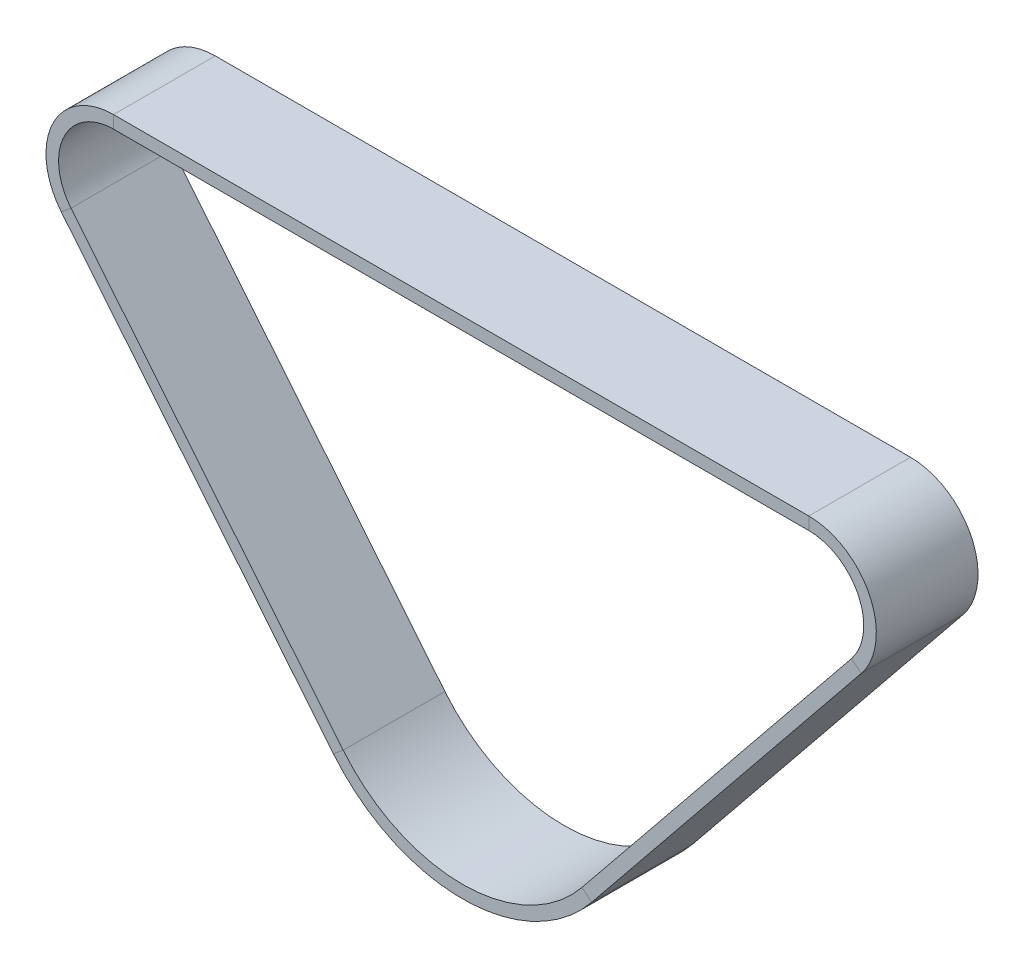
ISO-10303-21;
HEADER;
FILE_DESCRIPTION(('STEP AP214'),'2;1');
FILE_NAME('part.step','',(''),(''),'','','');
FILE_SCHEMA(('AUTOMOTIVE_DESIGN { 1 0 10303 214 1 1 1 1 }'));
ENDSEC;
DATA;
#1=APPLICATION_CONTEXT('core data for automotive mechanical design processes');
#2=APPLICATION_PROTOCOL_DEFINITION('international standard','automotive_design',2000,#1);
#3=PRODUCT_CONTEXT('',#1,'mechanical');
#4=PRODUCT('Part','Part','',(#3));
#5=PRODUCT_RELATED_PRODUCT_CATEGORY('part','',(#4));
#6=PRODUCT_DEFINITION_FORMATION('','',#4);
#7=PRODUCT_DEFINITION_CONTEXT('part definition',#1,'design');
#8=PRODUCT_DEFINITION('design','',#6,#7);
#9=PRODUCT_DEFINITION_SHAPE('','',#8);
#10=(LENGTH_UNIT() NAMED_UNIT(*) SI_UNIT(.MILLI.,.METRE.));
#11=(NAMED_UNIT(*) PLANE_ANGLE_UNIT() SI_UNIT($,.RADIAN.));
#12=(NAMED_UNIT(*) SI_UNIT($,.STERADIAN.) SOLID_ANGLE_UNIT());
#13=UNCERTAINTY_MEASURE_WITH_UNIT(LENGTH_MEASURE(1.E-05),#10,'distance_accuracy_value','');
#14=(GEOMETRIC_REPRESENTATION_CONTEXT(3) GLOBAL_UNCERTAINTY_ASSIGNED_CONTEXT((#13)) GLOBAL_UNIT_ASSIGNED_CONTEXT((#10,
#11,#12)) REPRESENTATION_CONTEXT('',''));
#15=CARTESIAN_POINT('',(0.,0.,0.));
#16=DIRECTION('',(0.,0.,1.));
#17=DIRECTION('',(1.,0.,0.));
#18=AXIS2_PLACEMENT_3D('',#15,#16,#17);
#19=CARTESIAN_POINT('',(86.8218168177366,8.43740000000001,6.35));
#20=DIRECTION('',(0.,0.,-1.));
#21=DIRECTION('',(-1.,0.,0.));
#22=AXIS2_PLACEMENT_3D('',#19,#20,#21);
#23=PLANE('',#22);
#24=DIRECTION('',(0.,-1.,0.));
#25=VECTOR('',#24,1.);
#26=CARTESIAN_POINT('',(86.8218168177366,8.43740000000001,6.35));
#27=LINE('',#26,#25);
#28=CARTESIAN_POINT('',(86.8218168177366,8.43740000000001,6.35));
#29=VERTEX_POINT('',#28);
#30=CARTESIAN_POINT('',(86.8218168177366,6.86260000000001,6.35));
#31=VERTEX_POINT('',#30);
#32=EDGE_CURVE('E187',#29,#31,#27,.T.);
#33=ORIENTED_EDGE('',*,*,#32,.F.);
#34=DIRECTION('',(-1.,0.,0.));
#35=VECTOR('',#34,1.);
#36=CARTESIAN_POINT('',(86.8218168177366,8.43740000000001,6.35));
#37=LINE('',#36,#35);
#38=CARTESIAN_POINT('',(0.,8.4374,6.35));
#39=VERTEX_POINT('',#38);
#40=EDGE_CURVE('E186',#29,#39,#37,.T.);
#41=ORIENTED_EDGE('',*,*,#40,.T.);
#42=DIRECTION('',(0.,-1.,0.));
#43=VECTOR('',#42,1.);
#44=CARTESIAN_POINT('',(0.,8.4374,6.35));
#45=LINE('',#44,#43);
#46=CARTESIAN_POINT('',(0.,6.8626,6.35));
#47=VERTEX_POINT('',#46);
#48=EDGE_CURVE('E161',#39,#47,#45,.T.);
#49=ORIENTED_EDGE('',*,*,#48,.T.);
#50=DIRECTION('',(-1.,0.,0.));
#51=VECTOR('',#50,1.);
#52=CARTESIAN_POINT('',(86.8218168177366,6.86260000000001,6.35));
#53=LINE('',#52,#51);
#54=EDGE_CURVE('E191',#31,#47,#53,.T.);
#55=ORIENTED_EDGE('',*,*,#54,.F.);
#56=EDGE_LOOP('',(#33,#41,#49,#55));
#57=FACE_BOUND('',#56,.T.);
#58=ADVANCED_FACE('F41',(#57),#23,.F.);
#59=CARTESIAN_POINT('',(0.,8.4374,6.35));
#60=DIRECTION('',(0.,0.,-1.));
#61=DIRECTION('',(-1.,0.,0.));
#62=AXIS2_PLACEMENT_3D('',#59,#60,#61);
#63=PLANE('',#62);
#64=CARTESIAN_POINT('',(0.,0.,6.35));
#65=DIRECTION('',(0.,0.,1.));
#66=DIRECTION('',(0.,1.,0.));
#67=AXIS2_PLACEMENT_3D('',#64,#65,#66);
#68=CIRCLE('',#67,6.8626);
#69=CARTESIAN_POINT('',(-5.31507576768059,-4.34111141803738,6.35));
#70=VERTEX_POINT('',#69);
#71=EDGE_CURVE('E167',#47,#70,#68,.T.);
#72=ORIENTED_EDGE('',*,*,#71,.F.);
#73=ORIENTED_EDGE('',*,*,#48,.F.);
#74=CARTESIAN_POINT('',(0.,0.,6.35));
#75=DIRECTION('',(0.,0.,1.));
#76=DIRECTION('',(0.,1.,0.));
#77=AXIS2_PLACEMENT_3D('',#74,#75,#76);
#78=CIRCLE('',#77,8.4374);
#79=CARTESIAN_POINT('',(-6.53475654740597,-5.33729103817046,6.35));
#80=VERTEX_POINT('',#79);
#81=EDGE_CURVE('E165',#39,#80,#78,.T.);
#82=ORIENTED_EDGE('',*,*,#81,.T.);
#83=DIRECTION('',(0.774498844123305,0.632575323935153,0.));
#84=VECTOR('',#83,1.);
#85=CARTESIAN_POINT('',(-6.53475654740597,-5.33729103817046,6.35));
#86=LINE('',#85,#84);
#87=EDGE_CURVE('E183',#80,#70,#86,.T.);
#88=ORIENTED_EDGE('',*,*,#87,.T.);
#89=EDGE_LOOP('',(#72,#73,#82,#88));
#90=FACE_BOUND('',#89,.T.);
#91=ADVANCED_FACE('F163',(#90),#63,.F.);
#92=CARTESIAN_POINT('',(0.,0.,0.));
#93=DIRECTION('',(0.,0.,1.));
#94=DIRECTION('',(1.,0.,0.));
#95=AXIS2_PLACEMENT_3D('',#92,#93,#94);
#96=CYLINDRICAL_SURFACE('',#95,6.8626);
#97=CARTESIAN_POINT('',(0.,0.,-6.35));
#98=DIRECTION('',(0.,0.,1.));
#99=DIRECTION('',(0.,1.,0.));
#100=AXIS2_PLACEMENT_3D('',#97,#98,#99);
#101=CIRCLE('',#100,6.8626);
#102=CARTESIAN_POINT('',(0.,6.8626,-6.35));
#103=VERTEX_POINT('',#102);
#104=CARTESIAN_POINT('',(-5.31507576768059,-4.34111141803738,-6.35));
#105=VERTEX_POINT('',#104);
#106=EDGE_CURVE('E237',#103,#105,#101,.T.);
#107=ORIENTED_EDGE('',*,*,#106,.F.);
#108=DIRECTION('',(0.,0.,-1.));
#109=VECTOR('',#108,1.);
#110=CARTESIAN_POINT('',(0.,6.8626,6.35));
#111=LINE('',#110,#109);
#112=EDGE_CURVE('E172',#47,#103,#111,.T.);
#113=ORIENTED_EDGE('',*,*,#112,.F.);
#114=ORIENTED_EDGE('',*,*,#71,.T.);
#115=DIRECTION('',(0.,0.,-1.));
#116=VECTOR('',#115,1.);
#117=CARTESIAN_POINT('',(-5.31507576768059,-4.34111141803738,6.35));
#118=LINE('',#117,#116);
#119=EDGE_CURVE('E269',#70,#105,#118,.T.);
#120=ORIENTED_EDGE('',*,*,#119,.T.);
#121=EDGE_LOOP('',(#107,#113,#114,#120));
#122=FACE_BOUND('',#121,.T.);
#123=ADVANCED_FACE('F314',(#122),#96,.F.);
#124=CARTESIAN_POINT('',(0.,8.4374,-6.35));
#125=DIRECTION('',(0.,0.,1.));
#126=DIRECTION('',(1.,0.,0.));
#127=AXIS2_PLACEMENT_3D('',#124,#125,#126);
#128=PLANE('',#127);
#129=CARTESIAN_POINT('',(0.,0.,-6.35));
#130=DIRECTION('',(0.,0.,1.));
#131=DIRECTION('',(0.,1.,0.));
#132=AXIS2_PLACEMENT_3D('',#129,#130,#131);
#133=CIRCLE('',#132,8.4374);
#134=CARTESIAN_POINT('',(0.,8.4374,-6.35));
#135=VERTEX_POINT('',#134);
#136=CARTESIAN_POINT('',(-6.53475654740597,-5.33729103817046,-6.35));
#137=VERTEX_POINT('',#136);
#138=EDGE_CURVE('E202',#135,#137,#133,.T.);
#139=ORIENTED_EDGE('',*,*,#138,.F.);
#140=DIRECTION('',(0.,1.,0.));
#141=VECTOR('',#140,1.);
#142=CARTESIAN_POINT('',(0.,8.4374,-6.35));
#143=LINE('',#142,#141);
#144=EDGE_CURVE('E194',#103,#135,#143,.T.);
#145=ORIENTED_EDGE('',*,*,#144,.F.);
#146=ORIENTED_EDGE('',*,*,#106,.T.);
#147=DIRECTION('',(-0.774498844123305,-0.632575323935153,0.));
#148=VECTOR('',#147,1.);
#149=CARTESIAN_POINT('',(-6.53475654740597,-5.33729103817046,-6.35));
#150=LINE('',#149,#148);
#151=EDGE_CURVE('E240',#105,#137,#150,.T.);
#152=ORIENTED_EDGE('',*,*,#151,.T.);
#153=EDGE_LOOP('',(#139,#145,#146,#152));
#154=FACE_BOUND('',#153,.T.);
#155=ADVANCED_FACE('F235',(#154),#128,.F.);
#156=CARTESIAN_POINT('',(0.,0.,0.));
#157=DIRECTION('',(0.,0.,1.));
#158=DIRECTION('',(1.,0.,0.));
#159=AXIS2_PLACEMENT_3D('',#156,#157,#158);
#160=CYLINDRICAL_SURFACE('',#159,8.4374);
#161=DIRECTION('',(0.,0.,1.));
#162=VECTOR('',#161,1.);
#163=CARTESIAN_POINT('',(-6.53475654740597,-5.33729103817046,6.35));
#164=LINE('',#163,#162);
#165=EDGE_CURVE('E181',#137,#80,#164,.T.);
#166=ORIENTED_EDGE('',*,*,#165,.T.);
#167=ORIENTED_EDGE('',*,*,#81,.F.);
#168=DIRECTION('',(0.,0.,1.));
#169=VECTOR('',#168,1.);
#170=CARTESIAN_POINT('',(0.,8.4374,6.35));
#171=LINE('',#170,#169);
#172=EDGE_CURVE('E179',#135,#39,#171,.T.);
#173=ORIENTED_EDGE('',*,*,#172,.F.);
#174=ORIENTED_EDGE('',*,*,#138,.T.);
#175=EDGE_LOOP('',(#166,#167,#173,#174));
#176=FACE_BOUND('',#175,.T.);
#177=ADVANCED_FACE('F177',(#176),#160,.T.);
#178=CARTESIAN_POINT('',(-6.53475654740598,-5.33729103817046,6.35));
#179=DIRECTION('',(0.,0.,-1.));
#180=DIRECTION('',(-1.,0.,0.));
#181=AXIS2_PLACEMENT_3D('',#178,#179,#180);
#182=PLANE('',#181);
#183=DIRECTION('',(0.632575323935153,-0.774498844123305,0.));
#184=VECTOR('',#183,1.);
#185=CARTESIAN_POINT('',(-5.3150757676806,-4.34111141803738,6.35));
#186=LINE('',#185,#184);
#187=CARTESIAN_POINT('',(28.6807719162639,-45.9642094744297,6.35));
#188=VERTEX_POINT('',#187);
#189=EDGE_CURVE('E274',#70,#188,#186,.T.);
#190=ORIENTED_EDGE('',*,*,#189,.F.);
#191=ORIENTED_EDGE('',*,*,#87,.F.);
#192=DIRECTION('',(0.632575323935153,-0.774498844123305,0.));
#193=VECTOR('',#192,1.);
#194=CARTESIAN_POINT('',(-6.53475654740598,-5.33729103817046,6.35));
#195=LINE('',#194,#193);
#196=CARTESIAN_POINT('',(27.4610911365385,-46.9603890945627,6.35));
#197=VERTEX_POINT('',#196);
#198=EDGE_CURVE('E201',#80,#197,#195,.T.);
#199=ORIENTED_EDGE('',*,*,#198,.T.);
#200=DIRECTION('',(0.774498844123305,0.632575323935153,0.));
#201=VECTOR('',#200,1.);
#202=CARTESIAN_POINT('',(27.4610911365386,-46.9603890945628,6.35));
#203=LINE('',#202,#201);
#204=EDGE_CURVE('E293',#197,#188,#203,.T.);
#205=ORIENTED_EDGE('',*,*,#204,.T.);
#206=EDGE_LOOP('',(#190,#191,#199,#205));
#207=FACE_BOUND('',#206,.T.);
#208=ADVANCED_FACE('F317',(#207),#182,.F.);
#209=CARTESIAN_POINT('',(-5.3150757676806,-4.34111141803738,6.35));
#210=DIRECTION('',(-0.774498844123305,-0.632575323935153,0.));
#211=DIRECTION('',(0.632575323935153,-0.774498844123306,0.));
#212=AXIS2_PLACEMENT_3D('',#209,#210,#211);
#213=PLANE('',#212);
#214=DIRECTION('',(0.632575323935153,-0.774498844123305,0.));
#215=VECTOR('',#214,1.);
#216=CARTESIAN_POINT('',(-5.31507576768059,-4.34111141803738,-6.35));
#217=LINE('',#216,#215);
#218=CARTESIAN_POINT('',(28.6807719162639,-45.9642094744297,-6.35));
#219=VERTEX_POINT('',#218);
#220=EDGE_CURVE('E248',#105,#219,#217,.T.);
#221=ORIENTED_EDGE('',*,*,#220,.F.);
#222=ORIENTED_EDGE('',*,*,#119,.F.);
#223=ORIENTED_EDGE('',*,*,#189,.T.);
#224=DIRECTION('',(0.,0.,-1.));
#225=VECTOR('',#224,1.);
#226=CARTESIAN_POINT('',(28.6807719162639,-45.9642094744297,6.35));
#227=LINE('',#226,#225);
#228=EDGE_CURVE('E272',#188,#219,#227,.T.);
#229=ORIENTED_EDGE('',*,*,#228,.T.);
#230=EDGE_LOOP('',(#221,#222,#223,#229));
#231=FACE_BOUND('',#230,.T.);
#232=ADVANCED_FACE('F280',(#231),#213,.F.);
#233=CARTESIAN_POINT('',(-6.53475654740598,-5.33729103817046,-6.35));
#234=DIRECTION('',(0.,0.,1.));
#235=DIRECTION('',(1.,0.,0.));
#236=AXIS2_PLACEMENT_3D('',#233,#234,#235);
#237=PLANE('',#236);
#238=DIRECTION('',(0.632575323935153,-0.774498844123305,0.));
#239=VECTOR('',#238,1.);
#240=CARTESIAN_POINT('',(-6.53475654740598,-5.33729103817046,-6.35));
#241=LINE('',#240,#239);
#242=CARTESIAN_POINT('',(27.4610911365385,-46.9603890945627,-6.35));
#243=VERTEX_POINT('',#242);
#244=EDGE_CURVE('E207',#137,#243,#241,.T.);
#245=ORIENTED_EDGE('',*,*,#244,.F.);
#246=ORIENTED_EDGE('',*,*,#151,.F.);
#247=ORIENTED_EDGE('',*,*,#220,.T.);
#248=DIRECTION('',(-0.774498844123305,-0.632575323935153,0.));
#249=VECTOR('',#248,1.);
#250=CARTESIAN_POINT('',(27.4610911365386,-46.9603890945628,-6.35));
#251=LINE('',#250,#249);
#252=EDGE_CURVE('E245',#219,#243,#251,.T.);
#253=ORIENTED_EDGE('',*,*,#252,.T.);
#254=EDGE_LOOP('',(#245,#246,#247,#253));
#255=FACE_BOUND('',#254,.T.);
#256=ADVANCED_FACE('F277',(#255),#237,.F.);
#257=CARTESIAN_POINT('',(-6.53475654740598,-5.33729103817046,6.35));
#258=DIRECTION('',(0.774498844123305,0.632575323935153,0.));
#259=DIRECTION('',(-0.632575323935153,0.774498844123306,0.));
#260=AXIS2_PLACEMENT_3D('',#257,#258,#259);
#261=PLANE('',#260);
#262=DIRECTION('',(0.,0.,1.));
#263=VECTOR('',#262,1.);
#264=CARTESIAN_POINT('',(27.4610911365386,-46.9603890945628,6.35));
#265=LINE('',#264,#263);
#266=EDGE_CURVE('E203',#243,#197,#265,.T.);
#267=ORIENTED_EDGE('',*,*,#266,.T.);
#268=ORIENTED_EDGE('',*,*,#198,.F.);
#269=ORIENTED_EDGE('',*,*,#165,.F.);
#270=ORIENTED_EDGE('',*,*,#244,.T.);
#271=EDGE_LOOP('',(#267,#268,#269,#270));
#272=FACE_BOUND('',#271,.T.);
#273=ADVANCED_FACE('F290',(#272),#261,.F.);
#274=CARTESIAN_POINT('',(27.4610911365386,-46.9603890945628,6.35));
#275=DIRECTION('',(0.,0.,-1.));
#276=DIRECTION('',(-1.,0.,0.));
#277=AXIS2_PLACEMENT_3D('',#274,#275,#276);
#278=PLANE('',#277);
#279=CARTESIAN_POINT('',(43.5609084088674,-33.8107928057932,6.35));
#280=DIRECTION('',(0.,0.,1.));
#281=DIRECTION('',(-0.774498844123305,-0.632575323935153,0.));
#282=AXIS2_PLACEMENT_3D('',#279,#280,#281);
#283=CIRCLE('',#282,19.2126);
#284=CARTESIAN_POINT('',(58.4936612595163,-45.8995020446423,6.35));
#285=VERTEX_POINT('',#284);
#286=EDGE_CURVE('E142',#188,#285,#283,.T.);
#287=ORIENTED_EDGE('',*,*,#286,.F.);
#288=ORIENTED_EDGE('',*,*,#204,.F.);
#289=CARTESIAN_POINT('',(43.5609084088674,-33.8107928057932,6.35));
#290=DIRECTION('',(0.,0.,1.));
#291=DIRECTION('',(-0.774498844123305,-0.632575323935153,0.));
#292=AXIS2_PLACEMENT_3D('',#289,#290,#291);
#293=CIRCLE('',#292,20.7874);
#294=CARTESIAN_POINT('',(59.7176548464958,-46.8903777881304,6.35));
#295=VERTEX_POINT('',#294);
#296=EDGE_CURVE('E206',#197,#295,#293,.T.);
#297=ORIENTED_EDGE('',*,*,#296,.T.);
#298=DIRECTION('',(-0.777237482206934,0.629207355529658,0.));
#299=VECTOR('',#298,1.);
#300=CARTESIAN_POINT('',(59.7176548464958,-46.8903777881304,6.35));
#301=LINE('',#300,#299);
#302=EDGE_CURVE('E298',#295,#285,#301,.T.);
#303=ORIENTED_EDGE('',*,*,#302,.T.);
#304=EDGE_LOOP('',(#287,#288,#297,#303));
#305=FACE_BOUND('',#304,.T.);
#306=ADVANCED_FACE('F319',(#305),#278,.F.);
#307=CARTESIAN_POINT('',(43.5609084088674,-33.8107928057932,0.));
#308=DIRECTION('',(0.,0.,1.));
#309=DIRECTION('',(1.,0.,0.));
#310=AXIS2_PLACEMENT_3D('',#307,#308,#309);
#311=CYLINDRICAL_SURFACE('',#310,19.2126);
#312=CARTESIAN_POINT('',(43.5609084088674,-33.8107928057932,-6.35));
#313=DIRECTION('',(0.,0.,1.));
#314=DIRECTION('',(-0.774498844123306,-0.632575323935153,0.));
#315=AXIS2_PLACEMENT_3D('',#312,#313,#314);
#316=CIRCLE('',#315,19.2126);
#317=CARTESIAN_POINT('',(58.4936612595163,-45.8995020446423,-6.35));
#318=VERTEX_POINT('',#317);
#319=EDGE_CURVE('E136',#219,#318,#316,.T.);
#320=ORIENTED_EDGE('',*,*,#319,.F.);
#321=ORIENTED_EDGE('',*,*,#228,.F.);
#322=ORIENTED_EDGE('',*,*,#286,.T.);
#323=DIRECTION('',(0.,0.,-1.));
#324=VECTOR('',#323,1.);
#325=CARTESIAN_POINT('',(58.4936612595163,-45.8995020446423,6.35));
#326=LINE('',#325,#324);
#327=EDGE_CURVE('E251',#285,#318,#326,.T.);
#328=ORIENTED_EDGE('',*,*,#327,.T.);
#329=EDGE_LOOP('',(#320,#321,#322,#328));
#330=FACE_BOUND('',#329,.T.);
#331=ADVANCED_FACE('F283',(#330),#311,.F.);
#332=CARTESIAN_POINT('',(27.4610911365386,-46.9603890945628,-6.35));
#333=DIRECTION('',(0.,0.,1.));
#334=DIRECTION('',(1.,0.,0.));
#335=AXIS2_PLACEMENT_3D('',#332,#333,#334);
#336=PLANE('',#335);
#337=CARTESIAN_POINT('',(43.5609084088674,-33.8107928057932,-6.35));
#338=DIRECTION('',(0.,0.,1.));
#339=DIRECTION('',(-0.774498844123305,-0.632575323935153,0.));
#340=AXIS2_PLACEMENT_3D('',#337,#338,#339);
#341=CIRCLE('',#340,20.7874);
#342=CARTESIAN_POINT('',(59.7176548464958,-46.8903777881304,-6.35));
#343=VERTEX_POINT('',#342);
#344=EDGE_CURVE('E211',#243,#343,#341,.T.);
#345=ORIENTED_EDGE('',*,*,#344,.F.);
#346=ORIENTED_EDGE('',*,*,#252,.F.);
#347=ORIENTED_EDGE('',*,*,#319,.T.);
#348=DIRECTION('',(0.777237482206934,-0.629207355529658,0.));
#349=VECTOR('',#348,1.);
#350=CARTESIAN_POINT('',(59.7176548464958,-46.8903777881304,-6.35));
#351=LINE('',#350,#349);
#352=EDGE_CURVE('E249',#318,#343,#351,.T.);
#353=ORIENTED_EDGE('',*,*,#352,.T.);
#354=EDGE_LOOP('',(#345,#346,#347,#353));
#355=FACE_BOUND('',#354,.T.);
#356=ADVANCED_FACE('F284',(#355),#336,.F.);
#357=CARTESIAN_POINT('',(43.5609084088674,-33.8107928057932,0.));
#358=DIRECTION('',(0.,0.,1.));
#359=DIRECTION('',(1.,0.,0.));
#360=AXIS2_PLACEMENT_3D('',#357,#358,#359);
#361=CYLINDRICAL_SURFACE('',#360,20.7874);
#362=DIRECTION('',(0.,0.,1.));
#363=VECTOR('',#362,1.);
#364=CARTESIAN_POINT('',(59.7176548464958,-46.8903777881304,6.35));
#365=LINE('',#364,#363);
#366=EDGE_CURVE('E208',#343,#295,#365,.T.);
#367=ORIENTED_EDGE('',*,*,#366,.T.);
#368=ORIENTED_EDGE('',*,*,#296,.F.);
#369=ORIENTED_EDGE('',*,*,#266,.F.);
#370=ORIENTED_EDGE('',*,*,#344,.T.);
#371=EDGE_LOOP('',(#367,#368,#369,#370));
#372=FACE_BOUND('',#371,.T.);
#373=ADVANCED_FACE('F288',(#372),#361,.T.);
#374=CARTESIAN_POINT('',(59.7176548464958,-46.8903777881304,6.35));
#375=DIRECTION('',(0.,0.,-1.));
#376=DIRECTION('',(-1.,0.,0.));
#377=AXIS2_PLACEMENT_3D('',#374,#375,#376);
#378=PLANE('',#377);
#379=DIRECTION('',(0.629207355529658,0.777237482206934,0.));
#380=VECTOR('',#379,1.);
#381=CARTESIAN_POINT('',(58.4936612595163,-45.8995020446423,6.35));
#382=LINE('',#381,#380);
#383=CARTESIAN_POINT('',(92.1556867631299,-4.31799839805783,6.35));
#384=VERTEX_POINT('',#383);
#385=EDGE_CURVE('E116',#285,#384,#382,.T.);
#386=ORIENTED_EDGE('',*,*,#385,.F.);
#387=ORIENTED_EDGE('',*,*,#302,.F.);
#388=DIRECTION('',(0.629207355529658,0.777237482206934,0.));
#389=VECTOR('',#388,1.);
#390=CARTESIAN_POINT('',(59.7176548464958,-46.8903777881304,6.35));
#391=LINE('',#390,#389);
#392=CARTESIAN_POINT('',(93.3796803501094,-5.30887414154593,6.35));
#393=VERTEX_POINT('',#392);
#394=EDGE_CURVE('E210',#295,#393,#391,.T.);
#395=ORIENTED_EDGE('',*,*,#394,.T.);
#396=DIRECTION('',(-0.777237482206935,0.629207355529658,0.));
#397=VECTOR('',#396,1.);
#398=CARTESIAN_POINT('',(93.3796803501094,-5.30887414154592,6.35));
#399=LINE('',#398,#397);
#400=EDGE_CURVE('E220',#393,#384,#399,.T.);
#401=ORIENTED_EDGE('',*,*,#400,.T.);
#402=EDGE_LOOP('',(#386,#387,#395,#401));
#403=FACE_BOUND('',#402,.T.);
#404=ADVANCED_FACE('F322',(#403),#378,.F.);
#405=CARTESIAN_POINT('',(58.4936612595163,-45.8995020446423,6.35));
#406=DIRECTION('',(0.777237482206935,-0.629207355529658,0.));
#407=DIRECTION('',(0.629207355529658,0.777237482206935,0.));
#408=AXIS2_PLACEMENT_3D('',#405,#406,#407);
#409=PLANE('',#408);
#410=DIRECTION('',(0.629207355529658,0.777237482206934,0.));
#411=VECTOR('',#410,1.);
#412=CARTESIAN_POINT('',(58.4936612595163,-45.8995020446423,-6.35));
#413=LINE('',#412,#411);
#414=CARTESIAN_POINT('',(92.1556867631299,-4.31799839805783,-6.35));
#415=VERTEX_POINT('',#414);
#416=EDGE_CURVE('E109',#318,#415,#413,.T.);
#417=ORIENTED_EDGE('',*,*,#416,.F.);
#418=ORIENTED_EDGE('',*,*,#327,.F.);
#419=ORIENTED_EDGE('',*,*,#385,.T.);
#420=DIRECTION('',(0.,0.,-1.));
#421=VECTOR('',#420,1.);
#422=CARTESIAN_POINT('',(92.1556867631299,-4.31799839805782,6.35));
#423=LINE('',#422,#421);
#424=EDGE_CURVE('E218',#384,#415,#423,.T.);
#425=ORIENTED_EDGE('',*,*,#424,.T.);
#426=EDGE_LOOP('',(#417,#418,#419,#425));
#427=FACE_BOUND('',#426,.T.);
#428=ADVANCED_FACE('F323',(#427),#409,.F.);
#429=CARTESIAN_POINT('',(59.7176548464958,-46.8903777881304,-6.35));
#430=DIRECTION('',(0.,0.,1.));
#431=DIRECTION('',(1.,0.,0.));
#432=AXIS2_PLACEMENT_3D('',#429,#430,#431);
#433=PLANE('',#432);
#434=DIRECTION('',(0.629207355529658,0.777237482206934,0.));
#435=VECTOR('',#434,1.);
#436=CARTESIAN_POINT('',(59.7176548464958,-46.8903777881304,-6.35));
#437=LINE('',#436,#435);
#438=CARTESIAN_POINT('',(93.3796803501094,-5.30887414154593,-6.35));
#439=VERTEX_POINT('',#438);
#440=EDGE_CURVE('E100',#343,#439,#437,.T.);
#441=ORIENTED_EDGE('',*,*,#440,.F.);
#442=ORIENTED_EDGE('',*,*,#352,.F.);
#443=ORIENTED_EDGE('',*,*,#416,.T.);
#444=DIRECTION('',(0.777237482206935,-0.629207355529658,0.));
#445=VECTOR('',#444,1.);
#446=CARTESIAN_POINT('',(93.3796803501094,-5.30887414154592,-6.35));
#447=LINE('',#446,#445);
#448=EDGE_CURVE('E214',#415,#439,#447,.T.);
#449=ORIENTED_EDGE('',*,*,#448,.T.);
#450=EDGE_LOOP('',(#441,#442,#443,#449));
#451=FACE_BOUND('',#450,.T.);
#452=ADVANCED_FACE('F324',(#451),#433,.F.);
#453=CARTESIAN_POINT('',(59.7176548464958,-46.8903777881304,6.35));
#454=DIRECTION('',(-0.777237482206935,0.629207355529658,0.));
#455=DIRECTION('',(-0.629207355529658,-0.777237482206935,0.));
#456=AXIS2_PLACEMENT_3D('',#453,#454,#455);
#457=PLANE('',#456);
#458=DIRECTION('',(0.,0.,1.));
#459=VECTOR('',#458,1.);
#460=CARTESIAN_POINT('',(93.3796803501094,-5.30887414154592,6.35));
#461=LINE('',#460,#459);
#462=EDGE_CURVE('E212',#439,#393,#461,.T.);
#463=ORIENTED_EDGE('',*,*,#462,.T.);
#464=ORIENTED_EDGE('',*,*,#394,.F.);
#465=ORIENTED_EDGE('',*,*,#366,.F.);
#466=ORIENTED_EDGE('',*,*,#440,.T.);
#467=EDGE_LOOP('',(#463,#464,#465,#466));
#468=FACE_BOUND('',#467,.T.);
#469=ADVANCED_FACE('F325',(#468),#457,.F.);
#470=CARTESIAN_POINT('',(93.3796803501094,-5.30887414154592,6.35));
#471=DIRECTION('',(0.,0.,-1.));
#472=DIRECTION('',(-1.,0.,0.));
#473=AXIS2_PLACEMENT_3D('',#470,#471,#472);
#474=PLANE('',#473);
#475=CARTESIAN_POINT('',(86.8218168177366,0.,6.35));
#476=DIRECTION('',(0.,0.,1.));
#477=DIRECTION('',(0.777237482206935,-0.629207355529658,0.));
#478=AXIS2_PLACEMENT_3D('',#475,#476,#477);
#479=CIRCLE('',#478,6.8626);
#480=EDGE_CURVE('E259',#384,#31,#479,.T.);
#481=ORIENTED_EDGE('',*,*,#480,.F.);
#482=ORIENTED_EDGE('',*,*,#400,.F.);
#483=CARTESIAN_POINT('',(86.8218168177366,0.,6.35));
#484=DIRECTION('',(0.,0.,1.));
#485=DIRECTION('',(0.777237482206934,-0.629207355529658,0.));
#486=AXIS2_PLACEMENT_3D('',#483,#484,#485);
#487=CIRCLE('',#486,8.43739999999999);
#488=EDGE_CURVE('E213',#393,#29,#487,.T.);
#489=ORIENTED_EDGE('',*,*,#488,.T.);
#490=ORIENTED_EDGE('',*,*,#32,.T.);
#491=EDGE_LOOP('',(#481,#482,#489,#490));
#492=FACE_BOUND('',#491,.T.);
#493=ADVANCED_FACE('F326',(#492),#474,.F.);
#494=CARTESIAN_POINT('',(86.8218168177366,0.,0.));
#495=DIRECTION('',(0.,0.,1.));
#496=DIRECTION('',(1.,0.,0.));
#497=AXIS2_PLACEMENT_3D('',#494,#495,#496);
#498=CYLINDRICAL_SURFACE('',#497,6.8626);
#499=CARTESIAN_POINT('',(86.8218168177366,0.,-6.35));
#500=DIRECTION('',(0.,0.,1.));
#501=DIRECTION('',(0.777237482206935,-0.629207355529658,0.));
#502=AXIS2_PLACEMENT_3D('',#499,#500,#501);
#503=CIRCLE('',#502,6.8626);
#504=CARTESIAN_POINT('',(86.8218168177366,6.86260000000001,-6.35));
#505=VERTEX_POINT('',#504);
#506=EDGE_CURVE('E66',#415,#505,#503,.T.);
#507=ORIENTED_EDGE('',*,*,#506,.F.);
#508=ORIENTED_EDGE('',*,*,#424,.F.);
#509=ORIENTED_EDGE('',*,*,#480,.T.);
#510=DIRECTION('',(0.,0.,-1.));
#511=VECTOR('',#510,1.);
#512=CARTESIAN_POINT('',(86.8218168177366,6.86260000000001,6.35));
#513=LINE('',#512,#511);
#514=EDGE_CURVE('E257',#31,#505,#513,.T.);
#515=ORIENTED_EDGE('',*,*,#514,.T.);
#516=EDGE_LOOP('',(#507,#508,#509,#515));
#517=FACE_BOUND('',#516,.T.);
#518=ADVANCED_FACE('F309',(#517),#498,.F.);
#519=CARTESIAN_POINT('',(93.3796803501094,-5.30887414154592,-6.35));
#520=DIRECTION('',(0.,0.,1.));
#521=DIRECTION('',(1.,0.,0.));
#522=AXIS2_PLACEMENT_3D('',#519,#520,#521);
#523=PLANE('',#522);
#524=CARTESIAN_POINT('',(86.8218168177366,0.,-6.35));
#525=DIRECTION('',(0.,0.,1.));
#526=DIRECTION('',(0.777237482206934,-0.629207355529658,0.));
#527=AXIS2_PLACEMENT_3D('',#524,#525,#526);
#528=CIRCLE('',#527,8.43739999999999);
#529=CARTESIAN_POINT('',(86.8218168177366,8.43740000000001,-6.35));
#530=VERTEX_POINT('',#529);
#531=EDGE_CURVE('E58',#439,#530,#528,.T.);
#532=ORIENTED_EDGE('',*,*,#531,.F.);
#533=ORIENTED_EDGE('',*,*,#448,.F.);
#534=ORIENTED_EDGE('',*,*,#506,.T.);
#535=DIRECTION('',(0.,1.,0.));
#536=VECTOR('',#535,1.);
#537=CARTESIAN_POINT('',(86.8218168177366,8.43740000000001,-6.35));
#538=LINE('',#537,#536);
#539=EDGE_CURVE('E226',#505,#530,#538,.T.);
#540=ORIENTED_EDGE('',*,*,#539,.T.);
#541=EDGE_LOOP('',(#532,#533,#534,#540));
#542=FACE_BOUND('',#541,.T.);
#543=ADVANCED_FACE('F333',(#542),#523,.F.);
#544=CARTESIAN_POINT('',(86.8218168177366,0.,0.));
#545=DIRECTION('',(0.,0.,1.));
#546=DIRECTION('',(1.,0.,0.));
#547=AXIS2_PLACEMENT_3D('',#544,#545,#546);
#548=CYLINDRICAL_SURFACE('',#547,8.43739999999999);
#549=DIRECTION('',(0.,0.,1.));
#550=VECTOR('',#549,1.);
#551=CARTESIAN_POINT('',(86.8218168177366,8.43740000000001,6.35));
#552=LINE('',#551,#550);
#553=EDGE_CURVE('E45',#530,#29,#552,.T.);
#554=ORIENTED_EDGE('',*,*,#553,.T.);
#555=ORIENTED_EDGE('',*,*,#488,.F.);
#556=ORIENTED_EDGE('',*,*,#462,.F.);
#557=ORIENTED_EDGE('',*,*,#531,.T.);
#558=EDGE_LOOP('',(#554,#555,#556,#557));
#559=FACE_BOUND('',#558,.T.);
#560=ADVANCED_FACE('F227',(#559),#548,.T.);
#561=CARTESIAN_POINT('',(86.8218168177366,6.86260000000001,6.35));
#562=DIRECTION('',(0.,1.,0.));
#563=DIRECTION('',(-1.,0.,0.));
#564=AXIS2_PLACEMENT_3D('',#561,#562,#563);
#565=PLANE('',#564);
#566=ORIENTED_EDGE('',*,*,#54,.T.);
#567=ORIENTED_EDGE('',*,*,#112,.T.);
#568=DIRECTION('',(-1.,0.,0.));
#569=VECTOR('',#568,1.);
#570=CARTESIAN_POINT('',(86.8218168177366,6.86260000000001,-6.35));
#571=LINE('',#570,#569);
#572=EDGE_CURVE('E50',#505,#103,#571,.T.);
#573=ORIENTED_EDGE('',*,*,#572,.F.);
#574=ORIENTED_EDGE('',*,*,#514,.F.);
#575=EDGE_LOOP('',(#566,#567,#573,#574));
#576=FACE_BOUND('',#575,.T.);
#577=ADVANCED_FACE('F312',(#576),#565,.F.);
#578=CARTESIAN_POINT('',(86.8218168177366,8.43740000000001,-6.35));
#579=DIRECTION('',(0.,0.,1.));
#580=DIRECTION('',(0.,-1.,0.));
#581=AXIS2_PLACEMENT_3D('',#578,#579,#580);
#582=PLANE('',#581);
#583=ORIENTED_EDGE('',*,*,#572,.T.);
#584=ORIENTED_EDGE('',*,*,#144,.T.);
#585=DIRECTION('',(-1.,0.,0.));
#586=VECTOR('',#585,1.);
#587=CARTESIAN_POINT('',(86.8218168177366,8.43740000000001,-6.35));
#588=LINE('',#587,#586);
#589=EDGE_CURVE('E11',#530,#135,#588,.T.);
#590=ORIENTED_EDGE('',*,*,#589,.F.);
#591=ORIENTED_EDGE('',*,*,#539,.F.);
#592=EDGE_LOOP('',(#583,#584,#590,#591));
#593=FACE_BOUND('',#592,.T.);
#594=ADVANCED_FACE('F231',(#593),#582,.F.);
#595=CARTESIAN_POINT('',(86.8218168177366,8.43740000000001,6.35));
#596=DIRECTION('',(0.,-1.,0.));
#597=DIRECTION('',(1.,0.,0.));
#598=AXIS2_PLACEMENT_3D('',#595,#596,#597);
#599=PLANE('',#598);
#600=ORIENTED_EDGE('',*,*,#589,.T.);
#601=ORIENTED_EDGE('',*,*,#172,.T.);
#602=ORIENTED_EDGE('',*,*,#40,.F.);
#603=ORIENTED_EDGE('',*,*,#553,.F.);
#604=EDGE_LOOP('',(#600,#601,#602,#603));
#605=FACE_BOUND('',#604,.T.);
#606=ADVANCED_FACE('F43',(#605),#599,.F.);
#607=CLOSED_SHELL('',(#58,#91,#123,#155,#177,#208,#232,#256,#273,#306,#331,#356,#373,#404,#428,
#452,#469,#493,#518,#543,#560,#577,#594,#606));
#608=MANIFOLD_SOLID_BREP('B2',#607);
#609=ADVANCED_BREP_SHAPE_REPRESENTATION('',(#18,#608),#14);
#610=SHAPE_DEFINITION_REPRESENTATION(#9,#609);
ENDSEC;
END-ISO-10303-21;
